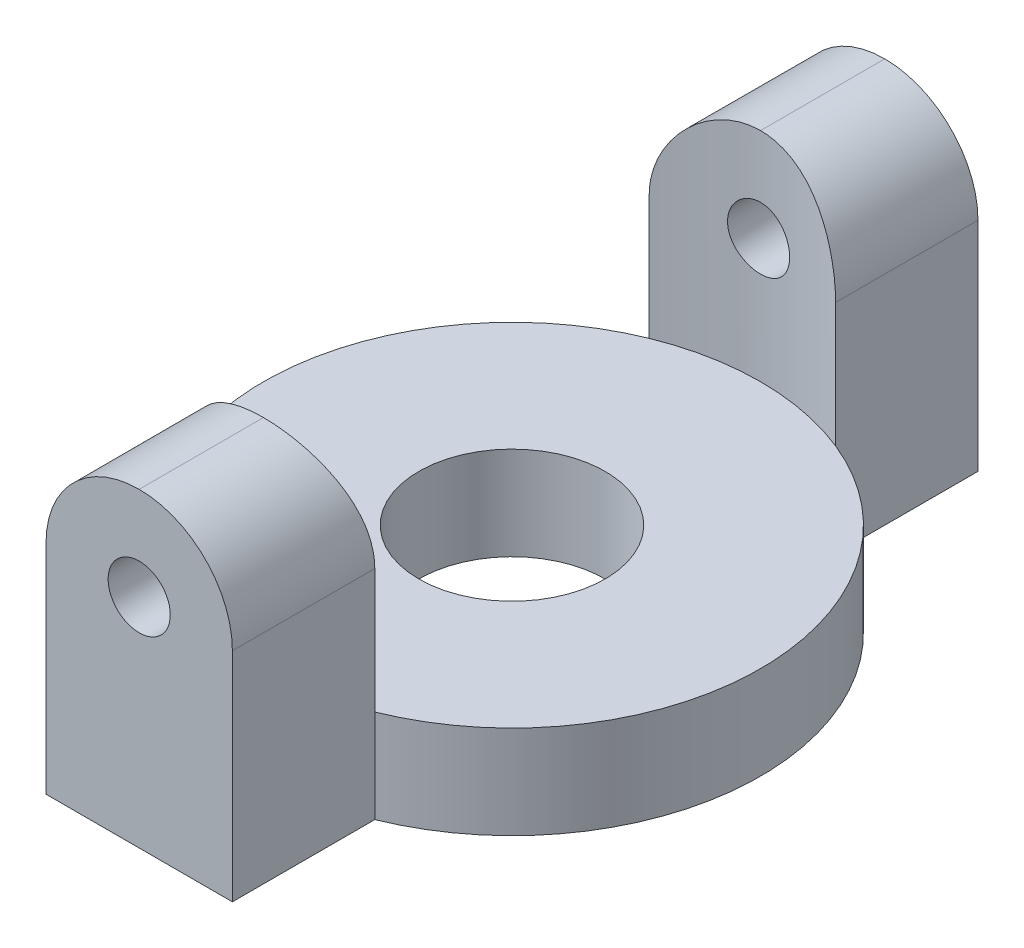
ISO-10303-21;
HEADER;
FILE_DESCRIPTION(('STEP AP214'),'2;1');
FILE_NAME('part.step','',(''),(''),'','','');
FILE_SCHEMA(('AUTOMOTIVE_DESIGN { 1 0 10303 214 1 1 1 1 }'));
ENDSEC;
DATA;
#1=APPLICATION_CONTEXT('core data for automotive mechanical design processes');
#2=APPLICATION_PROTOCOL_DEFINITION('international standard','automotive_design',2000,#1);
#3=PRODUCT_CONTEXT('',#1,'mechanical');
#4=PRODUCT('Part','Part','',(#3));
#5=PRODUCT_RELATED_PRODUCT_CATEGORY('part','',(#4));
#6=PRODUCT_DEFINITION_FORMATION('','',#4);
#7=PRODUCT_DEFINITION_CONTEXT('part definition',#1,'design');
#8=PRODUCT_DEFINITION('design','',#6,#7);
#9=PRODUCT_DEFINITION_SHAPE('','',#8);
#10=(LENGTH_UNIT() NAMED_UNIT(*) SI_UNIT(.MILLI.,.METRE.));
#11=(NAMED_UNIT(*) PLANE_ANGLE_UNIT() SI_UNIT($,.RADIAN.));
#12=(NAMED_UNIT(*) SI_UNIT($,.STERADIAN.) SOLID_ANGLE_UNIT());
#13=UNCERTAINTY_MEASURE_WITH_UNIT(LENGTH_MEASURE(1.E-05),#10,'distance_accuracy_value','');
#14=(GEOMETRIC_REPRESENTATION_CONTEXT(3) GLOBAL_UNCERTAINTY_ASSIGNED_CONTEXT((#13)) GLOBAL_UNIT_ASSIGNED_CONTEXT((#10,
#11,#12)) REPRESENTATION_CONTEXT('',''));
#15=CARTESIAN_POINT('',(0.,0.,0.));
#16=DIRECTION('',(0.,0.,1.));
#17=DIRECTION('',(1.,0.,0.));
#18=AXIS2_PLACEMENT_3D('',#15,#16,#17);
#19=CARTESIAN_POINT('',(0.,1.5,0.));
#20=DIRECTION('',(0.,-1.,0.));
#21=DIRECTION('',(0.,0.,-1.));
#22=AXIS2_PLACEMENT_3D('',#19,#20,#21);
#23=CYLINDRICAL_SURFACE('',#22,4.);
#24=DIRECTION('',(0.,-1.,0.));
#25=VECTOR('',#24,1.);
#26=CARTESIAN_POINT('',(-1.5,5.,-3.70809924354783));
#27=LINE('',#26,#25);
#28=CARTESIAN_POINT('',(-1.5,1.5,-3.70809924354783));
#29=VERTEX_POINT('',#28);
#30=CARTESIAN_POINT('',(-1.5,0.,-3.70809924354783));
#31=VERTEX_POINT('',#30);
#32=EDGE_CURVE('E139',#29,#31,#27,.T.);
#33=ORIENTED_EDGE('',*,*,#32,.T.);
#34=CARTESIAN_POINT('',(0.,0.,0.));
#35=DIRECTION('',(0.,1.,0.));
#36=DIRECTION('',(0.,0.,1.));
#37=AXIS2_PLACEMENT_3D('',#34,#35,#36);
#38=CIRCLE('',#37,4.);
#39=CARTESIAN_POINT('',(-1.5,0.,3.70809924354783));
#40=VERTEX_POINT('',#39);
#41=EDGE_CURVE('E121',#31,#40,#38,.T.);
#42=ORIENTED_EDGE('',*,*,#41,.T.);
#43=DIRECTION('',(0.,-1.,0.));
#44=VECTOR('',#43,1.);
#45=CARTESIAN_POINT('',(-1.5,1.5,3.70809924354783));
#46=LINE('',#45,#44);
#47=CARTESIAN_POINT('',(-1.5,1.5,3.70809924354783));
#48=VERTEX_POINT('',#47);
#49=EDGE_CURVE('E196',#48,#40,#46,.T.);
#50=ORIENTED_EDGE('',*,*,#49,.F.);
#51=CARTESIAN_POINT('',(0.,1.5,0.));
#52=DIRECTION('',(0.,1.,0.));
#53=DIRECTION('',(0.,0.,1.));
#54=AXIS2_PLACEMENT_3D('',#51,#52,#53);
#55=CIRCLE('',#54,4.);
#56=EDGE_CURVE('E141',#29,#48,#55,.T.);
#57=ORIENTED_EDGE('',*,*,#56,.F.);
#58=EDGE_LOOP('',(#33,#42,#50,#57));
#59=FACE_BOUND('',#58,.T.);
#60=ADVANCED_FACE('F33',(#59),#23,.T.);
#61=DIRECTION('',(0.,-1.,0.));
#62=VECTOR('',#61,1.);
#63=CARTESIAN_POINT('',(1.5,5.,-3.70809924354783));
#64=LINE('',#63,#62);
#65=CARTESIAN_POINT('',(1.5,1.5,-3.70809924354783));
#66=VERTEX_POINT('',#65);
#67=CARTESIAN_POINT('',(1.5,0.,-3.70809924354783));
#68=VERTEX_POINT('',#67);
#69=EDGE_CURVE('E170',#66,#68,#64,.T.);
#70=ORIENTED_EDGE('',*,*,#69,.F.);
#71=CARTESIAN_POINT('',(1.5,1.5,3.70809924354783));
#72=VERTEX_POINT('',#71);
#73=EDGE_CURVE('E194',#72,#66,#55,.T.);
#74=ORIENTED_EDGE('',*,*,#73,.F.);
#75=DIRECTION('',(0.,-1.,0.));
#76=VECTOR('',#75,1.);
#77=CARTESIAN_POINT('',(1.5,1.5,3.70809924354783));
#78=LINE('',#77,#76);
#79=CARTESIAN_POINT('',(1.5,0.,3.70809924354783));
#80=VERTEX_POINT('',#79);
#81=EDGE_CURVE('E200',#80,#72,#78,.F.);
#82=ORIENTED_EDGE('',*,*,#81,.F.);
#83=EDGE_CURVE('E134',#80,#68,#38,.T.);
#84=ORIENTED_EDGE('',*,*,#83,.T.);
#85=EDGE_LOOP('',(#70,#74,#82,#84));
#86=FACE_BOUND('',#85,.T.);
#87=ADVANCED_FACE('F238',(#86),#23,.T.);
#88=CARTESIAN_POINT('',(0.,1.5,0.));
#89=DIRECTION('',(0.,1.,0.));
#90=DIRECTION('',(0.,0.,1.));
#91=AXIS2_PLACEMENT_3D('',#88,#89,#90);
#92=PLANE('',#91);
#93=ORIENTED_EDGE('',*,*,#73,.T.);
#94=CARTESIAN_POINT('',(0.,1.5,0.));
#95=DIRECTION('',(0.,1.,0.));
#96=DIRECTION('',(0.,0.,1.));
#97=AXIS2_PLACEMENT_3D('',#94,#95,#96);
#98=CIRCLE('',#97,4.);
#99=EDGE_CURVE('E172',#66,#29,#98,.T.);
#100=ORIENTED_EDGE('',*,*,#99,.T.);
#101=ORIENTED_EDGE('',*,*,#56,.T.);
#102=EDGE_CURVE('E197',#48,#72,#55,.T.);
#103=ORIENTED_EDGE('',*,*,#102,.T.);
#104=EDGE_LOOP('',(#93,#100,#101,#103));
#105=FACE_BOUND('',#104,.T.);
#106=CARTESIAN_POINT('',(0.,1.5,0.));
#107=DIRECTION('',(0.,1.,0.));
#108=DIRECTION('',(0.,0.,1.));
#109=AXIS2_PLACEMENT_3D('',#106,#107,#108);
#110=CIRCLE('',#109,1.5);
#111=CARTESIAN_POINT('',(0.,1.5,1.5));
#112=VERTEX_POINT('',#111);
#113=EDGE_CURVE('E135',#112,#112,#110,.T.);
#114=ORIENTED_EDGE('',*,*,#113,.F.);
#115=EDGE_LOOP('',(#114));
#116=FACE_BOUND('',#115,.T.);
#117=ADVANCED_FACE('F235',(#105,#116),#92,.T.);
#118=CARTESIAN_POINT('',(0.,0.,0.));
#119=DIRECTION('',(0.,1.,0.));
#120=DIRECTION('',(0.,0.,1.));
#121=AXIS2_PLACEMENT_3D('',#118,#119,#120);
#122=PLANE('',#121);
#123=ORIENTED_EDGE('',*,*,#83,.F.);
#124=DIRECTION('',(0.,0.,-1.));
#125=VECTOR('',#124,1.);
#126=CARTESIAN_POINT('',(1.5,0.,3.70809924354783));
#127=LINE('',#126,#125);
#128=CARTESIAN_POINT('',(1.5,0.,5.99999999999999));
#129=VERTEX_POINT('',#128);
#130=EDGE_CURVE('E174',#129,#80,#127,.T.);
#131=ORIENTED_EDGE('',*,*,#130,.F.);
#132=DIRECTION('',(1.,0.,0.));
#133=VECTOR('',#132,1.);
#134=CARTESIAN_POINT('',(-1.5,0.,5.99999999999999));
#135=LINE('',#134,#133);
#136=CARTESIAN_POINT('',(-1.5,0.,5.99999999999999));
#137=VERTEX_POINT('',#136);
#138=EDGE_CURVE('E178',#137,#129,#135,.T.);
#139=ORIENTED_EDGE('',*,*,#138,.F.);
#140=DIRECTION('',(0.,0.,1.));
#141=VECTOR('',#140,1.);
#142=CARTESIAN_POINT('',(-1.5,0.,3.70809924354783));
#143=LINE('',#142,#141);
#144=EDGE_CURVE('E130',#40,#137,#143,.T.);
#145=ORIENTED_EDGE('',*,*,#144,.F.);
#146=ORIENTED_EDGE('',*,*,#41,.F.);
#147=DIRECTION('',(0.,0.,1.));
#148=VECTOR('',#147,1.);
#149=CARTESIAN_POINT('',(-1.5,0.,-6.));
#150=LINE('',#149,#148);
#151=CARTESIAN_POINT('',(-1.5,0.,-6.));
#152=VERTEX_POINT('',#151);
#153=EDGE_CURVE('E127',#152,#31,#150,.T.);
#154=ORIENTED_EDGE('',*,*,#153,.F.);
#155=DIRECTION('',(-1.,0.,0.));
#156=VECTOR('',#155,1.);
#157=CARTESIAN_POINT('',(-1.5,0.,-6.));
#158=LINE('',#157,#156);
#159=CARTESIAN_POINT('',(1.5,0.,-6.));
#160=VERTEX_POINT('',#159);
#161=EDGE_CURVE('E155',#160,#152,#158,.T.);
#162=ORIENTED_EDGE('',*,*,#161,.F.);
#163=DIRECTION('',(0.,0.,-1.));
#164=VECTOR('',#163,1.);
#165=CARTESIAN_POINT('',(1.5,0.,-6.));
#166=LINE('',#165,#164);
#167=EDGE_CURVE('E151',#68,#160,#166,.T.);
#168=ORIENTED_EDGE('',*,*,#167,.F.);
#169=EDGE_LOOP('',(#123,#131,#139,#145,#146,#154,#162,#168));
#170=FACE_BOUND('',#169,.T.);
#171=CARTESIAN_POINT('',(0.,0.,0.));
#172=DIRECTION('',(0.,1.,0.));
#173=DIRECTION('',(0.,0.,1.));
#174=AXIS2_PLACEMENT_3D('',#171,#172,#173);
#175=CIRCLE('',#174,1.5);
#176=CARTESIAN_POINT('',(0.,0.,1.5));
#177=VERTEX_POINT('',#176);
#178=EDGE_CURVE('E189',#177,#177,#175,.T.);
#179=ORIENTED_EDGE('',*,*,#178,.T.);
#180=EDGE_LOOP('',(#179));
#181=FACE_BOUND('',#180,.T.);
#182=ADVANCED_FACE('F123',(#170,#181),#122,.F.);
#183=CARTESIAN_POINT('',(0.,1.5,0.));
#184=DIRECTION('',(0.,-1.,0.));
#185=DIRECTION('',(0.,0.,-1.));
#186=AXIS2_PLACEMENT_3D('',#183,#184,#185);
#187=CYLINDRICAL_SURFACE('',#186,1.5);
#188=ORIENTED_EDGE('',*,*,#113,.T.);
#189=EDGE_LOOP('',(#188));
#190=FACE_BOUND('',#189,.T.);
#191=ORIENTED_EDGE('',*,*,#178,.F.);
#192=EDGE_LOOP('',(#191));
#193=FACE_BOUND('',#192,.T.);
#194=ADVANCED_FACE('F230',(#190,#193),#187,.F.);
#195=CARTESIAN_POINT('',(1.5,5.,3.70809924354783));
#196=DIRECTION('',(-1.,0.,0.));
#197=DIRECTION('',(0.,0.,1.));
#198=AXIS2_PLACEMENT_3D('',#195,#196,#197);
#199=PLANE('',#198);
#200=DIRECTION('',(0.,-1.,0.));
#201=VECTOR('',#200,1.);
#202=CARTESIAN_POINT('',(1.5,5.,3.70809924354783));
#203=LINE('',#202,#201);
#204=CARTESIAN_POINT('',(1.5,3.5,3.70809924354783));
#205=VERTEX_POINT('',#204);
#206=EDGE_CURVE('E187',#205,#72,#203,.T.);
#207=ORIENTED_EDGE('',*,*,#206,.F.);
#208=DIRECTION('',(0.,0.,-1.));
#209=VECTOR('',#208,1.);
#210=CARTESIAN_POINT('',(1.5,3.5,5.99999999999999));
#211=LINE('',#210,#209);
#212=CARTESIAN_POINT('',(1.5,3.5,5.99999999999999));
#213=VERTEX_POINT('',#212);
#214=EDGE_CURVE('E260',#205,#213,#211,.F.);
#215=ORIENTED_EDGE('',*,*,#214,.T.);
#216=DIRECTION('',(0.,-1.,0.));
#217=VECTOR('',#216,1.);
#218=CARTESIAN_POINT('',(1.5,5.,5.99999999999999));
#219=LINE('',#218,#217);
#220=EDGE_CURVE('E181',#213,#129,#219,.T.);
#221=ORIENTED_EDGE('',*,*,#220,.T.);
#222=ORIENTED_EDGE('',*,*,#130,.T.);
#223=ORIENTED_EDGE('',*,*,#81,.T.);
#224=EDGE_LOOP('',(#207,#215,#221,#222,#223));
#225=FACE_BOUND('',#224,.T.);
#226=ADVANCED_FACE('F223',(#225),#199,.F.);
#227=CARTESIAN_POINT('',(0.,5.,0.));
#228=DIRECTION('',(0.,-1.,0.));
#229=DIRECTION('',(0.,0.,-1.));
#230=AXIS2_PLACEMENT_3D('',#227,#228,#229);
#231=CYLINDRICAL_SURFACE('',#230,4.);
#232=CARTESIAN_POINT('',(0.5,3.5,3.96862696659689));
#233=CARTESIAN_POINT('',(0.49999881096679,3.52796725675837,3.96862736834266));
#234=CARTESIAN_POINT('',(0.497645579804257,3.55595199298096,3.96892579023789));
#235=CARTESIAN_POINT('',(0.488295282744268,3.61114264508092,3.97008678195994));
#236=CARTESIAN_POINT('',(0.481293364218259,3.63834771609941,3.97094994128592));
#237=CARTESIAN_POINT('',(0.462855338565192,3.69117197642321,3.97314114755086));
#238=CARTESIAN_POINT('',(0.451422240959648,3.71679222842373,3.9744688789073));
#239=CARTESIAN_POINT('',(0.424452839685906,3.76574569036462,3.97743924703982));
#240=CARTESIAN_POINT('',(0.408917237474958,3.78907929034861,3.97908182996857));
#241=CARTESIAN_POINT('',(0.374090690052884,3.83293244942443,3.9825071184878));
#242=CARTESIAN_POINT('',(0.354781363004859,3.85343736046378,3.98429048340409));
#243=CARTESIAN_POINT('',(0.312995052134246,3.89092455378782,3.98779046575167));
#244=CARTESIAN_POINT('',(0.290517910811607,3.90790666081894,3.98950707985877));
#245=CARTESIAN_POINT('',(0.242941966135194,3.93791871590127,3.99268688922565));
#246=CARTESIAN_POINT('',(0.217834739112223,3.95093540901993,3.99414922769361));
#247=CARTESIAN_POINT('',(0.165769343611183,3.97256223998819,3.99664847390905));
#248=CARTESIAN_POINT('',(0.138811243872181,3.9811725413853,3.99768539744594));
#249=CARTESIAN_POINT('',(0.0839591375502225,3.99369841366689,3.99921233741246));
#250=CARTESIAN_POINT('',(0.0560707719326756,3.99763833570478,3.99970518967188));
#251=CARTESIAN_POINT('',(2.46401373093254E-05,4.00078707700731,4.00009813945843));
#252=CARTESIAN_POINT('',(-0.0281331153989542,3.99999608239051,3.99999826030416));
#253=CARTESIAN_POINT('',(-0.0837530537949095,3.99372495944852,3.99921929554002));
#254=CARTESIAN_POINT('',(-0.111218241152891,3.98827102030373,3.99854344491145));
#255=CARTESIAN_POINT('',(-0.164840432781075,3.97286976467401,3.99669211188467));
#256=CARTESIAN_POINT('',(-0.190997412171241,3.96292236276663,3.99551661998809));
#257=CARTESIAN_POINT('',(-0.241341763087728,3.93878870144324,3.99279251561583));
#258=CARTESIAN_POINT('',(-0.265523645568104,3.92459110845396,3.99124290768648));
#259=CARTESIAN_POINT('',(-0.311171490461295,3.89236832755679,3.98794393813057));
#260=CARTESIAN_POINT('',(-0.332637328243472,3.87434296410629,3.98619456734453));
#261=CARTESIAN_POINT('',(-0.372397606154589,3.83482963628032,3.98267773504703));
#262=CARTESIAN_POINT('',(-0.390669367999199,3.81331884809067,3.98091023160946));
#263=CARTESIAN_POINT('',(-0.423346570125021,3.76752368864351,3.97756814388116));
#264=CARTESIAN_POINT('',(-0.437751998287019,3.74323930869239,3.97599356019516));
#265=CARTESIAN_POINT('',(-0.462288914716547,3.69256610088754,3.97321560522544));
#266=CARTESIAN_POINT('',(-0.472418585972466,3.66617638400936,3.97201239181626));
#267=CARTESIAN_POINT('',(-0.488096330893618,3.61205210929463,3.97011648499191));
#268=CARTESIAN_POINT('',(-0.493644625359924,3.58431761633826,3.96942376697341));
#269=CARTESIAN_POINT('',(-0.499972086381722,3.52849136360005,3.9686317775681));
#270=CARTESIAN_POINT('',(-0.500783168399657,3.50040327538224,3.96852853488475));
#271=CARTESIAN_POINT('',(-0.497697390646112,3.44449161406692,3.9689166822393));
#272=CARTESIAN_POINT('',(-0.493800631221962,3.41666803534414,3.9694080596029));
#273=CARTESIAN_POINT('',(-0.481436657159546,3.36217084728443,3.97092645696797));
#274=CARTESIAN_POINT('',(-0.472984896749212,3.33549367696192,3.97195166538932));
#275=CARTESIAN_POINT('',(-0.451766743823226,3.28393516902937,3.97442073994161));
#276=CARTESIAN_POINT('',(-0.439000199716245,3.25905389455183,3.97586462078153));
#277=CARTESIAN_POINT('',(-0.409436404430984,3.2116490712374,3.97901786270647));
#278=CARTESIAN_POINT('',(-0.392618223915422,3.18913866693712,3.98072858547417));
#279=CARTESIAN_POINT('',(-0.355458148473791,3.14724868921299,3.98421847910205));
#280=CARTESIAN_POINT('',(-0.335116116485097,3.1278692376264,3.98599765262258));
#281=CARTESIAN_POINT('',(-0.291346355111705,3.09267916253312,3.98943617737392));
#282=CARTESIAN_POINT('',(-0.267901698423407,3.076889510641,3.99109478782504));
#283=CARTESIAN_POINT('',(-0.218674516336358,3.04947235647324,3.99409422606322));
#284=CARTESIAN_POINT('',(-0.192892038073665,3.0378447703038,3.99543506025543));
#285=CARTESIAN_POINT('',(-0.139790771827891,3.01911644261839,3.99764458130638));
#286=CARTESIAN_POINT('',(-0.112476313302356,3.01200358079368,3.99851453137541));
#287=CARTESIAN_POINT('',(-0.0570292114555923,3.00246718215465,3.99968950935513));
#288=CARTESIAN_POINT('',(-0.0288966050876216,3.00004343388015,3.99999456274035));
#289=CARTESIAN_POINT('',(0.0271834366687568,2.99995801554157,4.00000525602733));
#290=CARTESIAN_POINT('',(0.0551308275429468,3.00226400788641,3.99971496633568));
#291=CARTESIAN_POINT('',(0.110237548290523,3.01150412268617,3.99857568231588));
#292=CARTESIAN_POINT('',(0.13739687871197,3.01843824192235,3.99772668837629));
#293=CARTESIAN_POINT('',(0.190152288597463,3.03672762286994,3.99556497042407));
#294=CARTESIAN_POINT('',(0.215748912031914,3.04808133587464,3.99425240886894));
#295=CARTESIAN_POINT('',(0.264678667428805,3.07488426292151,3.99130889521256));
#296=CARTESIAN_POINT('',(0.288011772477606,3.09033352565234,3.98967793932624));
#297=CARTESIAN_POINT('',(0.331917353592512,3.12500864306728,3.98626638785116));
#298=CARTESIAN_POINT('',(0.35247075756686,3.14425855870473,3.98448488255784));
#299=CARTESIAN_POINT('',(0.390068223763869,3.18593858880577,3.98098031802708));
#300=CARTESIAN_POINT('',(0.407111453558698,3.20836945549818,3.97925727273399));
#301=CARTESIAN_POINT('',(0.437261048503207,3.25587398453947,3.97605762278938));
#302=CARTESIAN_POINT('',(0.450351956633347,3.28095751798702,3.97458199550457));
#303=CARTESIAN_POINT('',(0.472117057668671,3.33297134811895,3.97205571623925));
#304=CARTESIAN_POINT('',(0.480796054245663,3.35989959986068,3.97100460230776));
#305=CARTESIAN_POINT('',(0.491413179247596,3.40580599740871,3.96970157363969));
#306=CARTESIAN_POINT('',(0.494628606202116,3.42449459030751,3.96930060304382));
#307=CARTESIAN_POINT('',(0.498922411181102,3.46211944999339,3.96876316445983));
#308=CARTESIAN_POINT('',(0.500000805419864,3.48105571490019,3.96862669446485));
#309=CARTESIAN_POINT('',(0.5,3.5,3.96862696659689));
#310=B_SPLINE_CURVE_WITH_KNOTS('',3,(#232,#233,#234,#235,#236,#237,#238,#239,#240,#241,#242,
#243,#244,#245,#246,#247,#248,#249,#250,#251,#252,#253,#254,#255,#256,#257,#258,#259,#260,#261,
#262,#263,#264,#265,#266,#267,#268,#269,#270,#271,#272,#273,#274,#275,#276,#277,#278,#279,#280,
#281,#282,#283,#284,#285,#286,#287,#288,#289,#290,#291,#292,#293,#294,#295,#296,#297,#298,#299,
#300,#301,#302,#303,#304,#305,#306,#307,#308,#309),.UNSPECIFIED.,.T.,.F.,(4,2,2,2,2,2,2,2,2,2,2,
2,2,2,2,2,2,2,2,2,2,2,2,2,2,2,2,2,2,2,2,2,2,2,2,2,2,2,4),(0.,0.0838325634958481,
0.167752775230476,0.251616090516241,0.335465075901226,0.419733155098132,0.504005425485158,
0.588556372291482,0.673104180679661,0.757209193882915,0.841310898340217,0.924943329866078,
1.00857735134358,1.09243640882561,1.17629931293821,1.26073539475554,1.34517174123885,
1.42964393347802,1.51411205431238,1.59801043561177,1.68190702865423,1.76552075258547,
1.84913741442371,1.93319563908822,2.01725713398962,2.10179777178469,2.18633670541776,
2.27064771356988,2.35495491954562,2.43868763257651,2.52242028737358,2.60612362708818,
2.6898279619285,2.77408025778167,2.85835251087966,2.94295019540967,3.02745557196403,
3.0842419792659,3.14102795571095),.UNSPECIFIED.);
#311=CARTESIAN_POINT('',(0.5,3.5,3.96862696659689));
#312=VERTEX_POINT('',#311);
#313=EDGE_CURVE('E152',#312,#312,#310,.T.);
#314=ORIENTED_EDGE('',*,*,#313,.T.);
#315=EDGE_LOOP('',(#314));
#316=FACE_BOUND('',#315,.T.);
#317=CARTESIAN_POINT('',(-1.5,3.5,3.70809924354783));
#318=CARTESIAN_POINT('',(-1.50000149763685,3.54059406944469,3.70809443488223));
#319=CARTESIAN_POINT('',(-1.49835105709716,3.58116700210062,3.70876668409977));
#320=CARTESIAN_POINT('',(-1.49177843163965,3.66199064316089,3.71141698257091));
#321=CARTESIAN_POINT('',(-1.48685734569824,3.70224145520554,3.71339459320577));
#322=CARTESIAN_POINT('',(-1.4672933482067,3.82177317368298,3.72119033682707));
#323=CARTESIAN_POINT('',(-1.44784901310297,3.90020255023084,3.72887225208868));
#324=CARTESIAN_POINT('',(-1.39690282812453,4.05236605283321,3.74825199333564));
#325=CARTESIAN_POINT('',(-1.3654109118427,4.12610398885652,3.75994650999366));
#326=CARTESIAN_POINT('',(-1.29134257885079,4.26733093712752,3.7860233337759));
#327=CARTESIAN_POINT('',(-1.24875666733342,4.33481452918674,3.80040794022651));
#328=CARTESIAN_POINT('',(-1.15146673631305,4.46489112753932,3.83103570457935));
#329=CARTESIAN_POINT('',(-1.0963044481655,4.52712847355882,3.84733331324471));
#330=CARTESIAN_POINT('',(-0.976395613097514,4.64172247941678,3.87949750401637));
#331=CARTESIAN_POINT('',(-0.911646994469713,4.69407699789396,3.89536399207354));
#332=CARTESIAN_POINT('',(-0.771671110191594,4.78915642250939,3.92553400925355));
#333=CARTESIAN_POINT('',(-0.696160035999175,4.83148819478568,3.93976501267995));
#334=CARTESIAN_POINT('',(-0.538489868027629,4.90267340318421,3.9643883038365));
#335=CARTESIAN_POINT('',(-0.456337903183922,4.93154107325354,3.97478464304361));
#336=CARTESIAN_POINT('',(-0.311568360413164,4.96861663077048,3.98831063781509));
#337=CARTESIAN_POINT('',(-0.249946259701632,4.98035013677682,3.9926612104967));
#338=CARTESIAN_POINT('',(-0.125564806183786,4.99605565812349,3.99852089820637));
#339=CARTESIAN_POINT('',(-0.0628049882167099,5.00002442312907,4.00002882328735));
#340=CARTESIAN_POINT('',(0.,5.,4.));
#341=B_SPLINE_CURVE_WITH_KNOTS('',3,(#317,#318,#319,#320,#321,#322,#323,#324,#325,#326,#327,
#328,#329,#330,#331,#332,#333,#334,#335,#336,#337,#338,#339,#340),.UNSPECIFIED.,.F.,.F.,(4,2,2,
2,2,2,2,2,2,2,2,4),(0.,0.121702070650528,0.243363268593939,0.485593089370354,0.727623613350252,
0.969861963846905,1.2229773776272,1.47614757238601,1.73802530937247,1.9996255640306,
2.18773738057225,2.37592792422954),.UNSPECIFIED.);
#342=CARTESIAN_POINT('',(-1.5,3.5,3.70809924354783));
#343=VERTEX_POINT('',#342);
#344=CARTESIAN_POINT('',(0.,5.,4.));
#345=VERTEX_POINT('',#344);
#346=EDGE_CURVE('E203',#343,#345,#341,.T.);
#347=ORIENTED_EDGE('',*,*,#346,.T.);
#348=CARTESIAN_POINT('',(0.,5.,4.));
#349=CARTESIAN_POINT('',(0.0406958829842198,5.00000122845831,4.0000033265242));
#350=CARTESIAN_POINT('',(0.0813709954107109,4.99834275632345,3.99937821643425));
#351=CARTESIAN_POINT('',(0.162404982142701,4.99173638518745,3.99690675065887));
#352=CARTESIAN_POINT('',(0.202763939083231,4.98678937686733,3.99506072565186));
#353=CARTESIAN_POINT('',(0.32265881815323,4.96711313108877,3.98776419542613));
#354=CARTESIAN_POINT('',(0.401351138250184,4.9475480884414,3.98055464040178));
#355=CARTESIAN_POINT('',(0.554057247937609,4.8962512721869,3.96219014943225));
#356=CARTESIAN_POINT('',(0.628073544622791,4.86452608396418,3.9510373492233));
#357=CARTESIAN_POINT('',(0.769768846215146,4.78991107942991,3.92589331480545));
#358=CARTESIAN_POINT('',(0.837443568408162,4.74701379100632,3.91190018231573));
#359=CARTESIAN_POINT('',(0.967344906860733,4.64938932798856,3.88186303805133));
#360=CARTESIAN_POINT('',(1.02926635746347,4.59427422550101,3.86576126025821));
#361=CARTESIAN_POINT('',(1.14324026520414,4.47459381666284,3.83360332452307));
#362=CARTESIAN_POINT('',(1.19528897996651,4.41002494311775,3.8175471861438));
#363=CARTESIAN_POINT('',(1.2900021675008,4.27025419725675,3.78661824913521));
#364=CARTESIAN_POINT('',(1.3322282773455,4.19473869535199,3.77181479391607));
#365=CARTESIAN_POINT('',(1.40321260233322,4.03707429030074,3.74598828763862));
#366=CARTESIAN_POINT('',(1.43198755826084,3.95493378254983,3.73496054207913));
#367=CARTESIAN_POINT('',(1.4688507799066,3.81040612672523,3.72058587751727));
#368=CARTESIAN_POINT('',(1.4804930770667,3.749033432505,3.71594709538589));
#369=CARTESIAN_POINT('',(1.49608314541372,3.62512431775426,3.7096837811096));
#370=CARTESIAN_POINT('',(1.50002515651037,3.56258706136285,3.70806150546337));
#371=CARTESIAN_POINT('',(1.5,3.5,3.70809924354783));
#372=B_SPLINE_CURVE_WITH_KNOTS('',3,(#348,#349,#350,#351,#352,#353,#354,#355,#356,#357,#358,
#359,#360,#361,#362,#363,#364,#365,#366,#367,#368,#369,#370,#371),.UNSPECIFIED.,.F.,.F.,(4,2,2,
2,2,2,2,2,2,2,2,4),(0.,0.122008525653372,0.24398401945963,0.486933412549049,0.729751420715098,
0.97273224908806,1.2249558748475,1.47727491867926,1.73930674597636,2.0010115846268,
2.18839922255604,2.37592697956526),.UNSPECIFIED.);
#373=EDGE_CURVE('E209',#345,#205,#372,.T.);
#374=ORIENTED_EDGE('',*,*,#373,.T.);
#375=ORIENTED_EDGE('',*,*,#206,.T.);
#376=ORIENTED_EDGE('',*,*,#102,.F.);
#377=DIRECTION('',(0.,-1.,0.));
#378=VECTOR('',#377,1.);
#379=CARTESIAN_POINT('',(-1.5,5.,3.70809924354783));
#380=LINE('',#379,#378);
#381=EDGE_CURVE('E185',#343,#48,#380,.T.);
#382=ORIENTED_EDGE('',*,*,#381,.F.);
#383=EDGE_LOOP('',(#347,#374,#375,#376,#382));
#384=FACE_BOUND('',#383,.T.);
#385=ADVANCED_FACE('F217',(#316,#384),#231,.F.);
#386=CARTESIAN_POINT('',(-1.5,5.,3.70809924354783));
#387=DIRECTION('',(1.,0.,0.));
#388=DIRECTION('',(0.,0.,-1.));
#389=AXIS2_PLACEMENT_3D('',#386,#387,#388);
#390=PLANE('',#389);
#391=DIRECTION('',(0.,-1.,0.));
#392=VECTOR('',#391,1.);
#393=CARTESIAN_POINT('',(-1.5,5.,5.99999999999999));
#394=LINE('',#393,#392);
#395=CARTESIAN_POINT('',(-1.5,3.5,5.99999999999999));
#396=VERTEX_POINT('',#395);
#397=EDGE_CURVE('E183',#396,#137,#394,.T.);
#398=ORIENTED_EDGE('',*,*,#397,.F.);
#399=DIRECTION('',(0.,0.,1.));
#400=VECTOR('',#399,1.);
#401=CARTESIAN_POINT('',(-1.5,3.5,3.70809924354783));
#402=LINE('',#401,#400);
#403=EDGE_CURVE('E266',#396,#343,#402,.F.);
#404=ORIENTED_EDGE('',*,*,#403,.T.);
#405=ORIENTED_EDGE('',*,*,#381,.T.);
#406=ORIENTED_EDGE('',*,*,#49,.T.);
#407=ORIENTED_EDGE('',*,*,#144,.T.);
#408=EDGE_LOOP('',(#398,#404,#405,#406,#407));
#409=FACE_BOUND('',#408,.T.);
#410=ADVANCED_FACE('F222',(#409),#390,.F.);
#411=CARTESIAN_POINT('',(-1.5,5.,5.99999999999999));
#412=DIRECTION('',(0.,0.,-1.));
#413=DIRECTION('',(-1.,0.,0.));
#414=AXIS2_PLACEMENT_3D('',#411,#412,#413);
#415=PLANE('',#414);
#416=CARTESIAN_POINT('',(0.,3.5,5.99999999999999));
#417=DIRECTION('',(0.,0.,1.));
#418=DIRECTION('',(1.,0.,0.));
#419=AXIS2_PLACEMENT_3D('',#416,#417,#418);
#420=CIRCLE('',#419,0.5);
#421=CARTESIAN_POINT('',(0.5,3.5,5.99999999999999));
#422=VERTEX_POINT('',#421);
#423=EDGE_CURVE('E321',#422,#422,#420,.T.);
#424=ORIENTED_EDGE('',*,*,#423,.F.);
#425=EDGE_LOOP('',(#424));
#426=FACE_BOUND('',#425,.T.);
#427=ORIENTED_EDGE('',*,*,#220,.F.);
#428=CARTESIAN_POINT('',(0.,3.5,5.99999999999999));
#429=DIRECTION('',(0.,0.,-1.));
#430=DIRECTION('',(-1.,0.,0.));
#431=AXIS2_PLACEMENT_3D('',#428,#429,#430);
#432=CIRCLE('',#431,1.5);
#433=CARTESIAN_POINT('',(0.,5.,5.99999999999999));
#434=VERTEX_POINT('',#433);
#435=EDGE_CURVE('E257',#213,#434,#432,.F.);
#436=ORIENTED_EDGE('',*,*,#435,.T.);
#437=CARTESIAN_POINT('',(0.,3.5,5.99999999999999));
#438=DIRECTION('',(0.,0.,-1.));
#439=DIRECTION('',(-1.,0.,0.));
#440=AXIS2_PLACEMENT_3D('',#437,#438,#439);
#441=CIRCLE('',#440,1.5);
#442=EDGE_CURVE('E267',#434,#396,#441,.F.);
#443=ORIENTED_EDGE('',*,*,#442,.T.);
#444=ORIENTED_EDGE('',*,*,#397,.T.);
#445=ORIENTED_EDGE('',*,*,#138,.T.);
#446=EDGE_LOOP('',(#427,#436,#443,#444,#445));
#447=FACE_BOUND('',#446,.T.);
#448=ADVANCED_FACE('F270',(#426,#447),#415,.F.);
#449=CARTESIAN_POINT('',(-1.5,5.,-6.));
#450=DIRECTION('',(1.,0.,0.));
#451=DIRECTION('',(0.,0.,-1.));
#452=AXIS2_PLACEMENT_3D('',#449,#450,#451);
#453=PLANE('',#452);
#454=CARTESIAN_POINT('',(-1.5,3.5,-3.70809924354783));
#455=VERTEX_POINT('',#454);
#456=EDGE_CURVE('E144',#455,#29,#27,.T.);
#457=ORIENTED_EDGE('',*,*,#456,.F.);
#458=DIRECTION('',(0.,0.,1.));
#459=VECTOR('',#458,1.);
#460=CARTESIAN_POINT('',(-1.5,3.5,-6.));
#461=LINE('',#460,#459);
#462=CARTESIAN_POINT('',(-1.5,3.5,-6.));
#463=VERTEX_POINT('',#462);
#464=EDGE_CURVE('E11',#455,#463,#461,.F.);
#465=ORIENTED_EDGE('',*,*,#464,.T.);
#466=DIRECTION('',(0.,-1.,0.));
#467=VECTOR('',#466,1.);
#468=CARTESIAN_POINT('',(-1.5,5.,-6.));
#469=LINE('',#468,#467);
#470=EDGE_CURVE('E149',#463,#152,#469,.T.);
#471=ORIENTED_EDGE('',*,*,#470,.T.);
#472=ORIENTED_EDGE('',*,*,#153,.T.);
#473=ORIENTED_EDGE('',*,*,#32,.F.);
#474=EDGE_LOOP('',(#457,#465,#471,#472,#473));
#475=FACE_BOUND('',#474,.T.);
#476=ADVANCED_FACE('F147',(#475),#453,.F.);
#477=CARTESIAN_POINT('',(0.,5.,0.));
#478=DIRECTION('',(0.,-1.,0.));
#479=DIRECTION('',(0.,0.,-1.));
#480=AXIS2_PLACEMENT_3D('',#477,#478,#479);
#481=CYLINDRICAL_SURFACE('',#480,4.);
#482=CARTESIAN_POINT('',(0.5,3.5,-3.96862696659689));
#483=CARTESIAN_POINT('',(0.49999881096679,3.47203274324163,-3.96862736834266));
#484=CARTESIAN_POINT('',(0.497645579804257,3.44404800701904,-3.96892579023789));
#485=CARTESIAN_POINT('',(0.488295282744268,3.38885735491908,-3.97008678195994));
#486=CARTESIAN_POINT('',(0.481293364218259,3.36165228390059,-3.97094994128592));
#487=CARTESIAN_POINT('',(0.462855338565192,3.30882802357679,-3.97314114755086));
#488=CARTESIAN_POINT('',(0.451422240959648,3.28320777157627,-3.9744688789073));
#489=CARTESIAN_POINT('',(0.424452839685906,3.23425430963538,-3.97743924703982));
#490=CARTESIAN_POINT('',(0.408917237474958,3.21092070965139,-3.97908182996857));
#491=CARTESIAN_POINT('',(0.374090690052884,3.16706755057557,-3.9825071184878));
#492=CARTESIAN_POINT('',(0.354781363004859,3.14656263953622,-3.98429048340409));
#493=CARTESIAN_POINT('',(0.312995052134246,3.10907544621219,-3.98779046575167));
#494=CARTESIAN_POINT('',(0.290517910811607,3.09209333918106,-3.98950707985877));
#495=CARTESIAN_POINT('',(0.242941966135194,3.06208128409873,-3.99268688922565));
#496=CARTESIAN_POINT('',(0.217834739112223,3.04906459098007,-3.99414922769361));
#497=CARTESIAN_POINT('',(0.165769343611183,3.02743776001181,-3.99664847390906));
#498=CARTESIAN_POINT('',(0.138811243872181,3.0188274586147,-3.99768539744594));
#499=CARTESIAN_POINT('',(0.0839591375502223,3.00630158633311,-3.99921233741246));
#500=CARTESIAN_POINT('',(0.0560707719326753,3.00236166429522,-3.99970518967188));
#501=CARTESIAN_POINT('',(2.46401373091187E-05,2.99921292299269,-4.00009813945843));
#502=CARTESIAN_POINT('',(-0.0281331153989544,3.00000391760949,-3.99999826030416));
#503=CARTESIAN_POINT('',(-0.0837530537949098,3.00627504055148,-3.99921929554002));
#504=CARTESIAN_POINT('',(-0.111218241152891,3.01172897969627,-3.99854344491145));
#505=CARTESIAN_POINT('',(-0.164840432781075,3.02713023532599,-3.99669211188467));
#506=CARTESIAN_POINT('',(-0.190997412171241,3.03707763723337,-3.99551661998809));
#507=CARTESIAN_POINT('',(-0.241341763087728,3.06121129855676,-3.99279251561583));
#508=CARTESIAN_POINT('',(-0.265523645568104,3.07540889154604,-3.99124290768648));
#509=CARTESIAN_POINT('',(-0.311171490461296,3.10763167244321,-3.98794393813057));
#510=CARTESIAN_POINT('',(-0.332637328243472,3.12565703589371,-3.98619456734453));
#511=CARTESIAN_POINT('',(-0.372397606154589,3.16517036371968,-3.98267773504703));
#512=CARTESIAN_POINT('',(-0.3906693679992,3.18668115190933,-3.98091023160946));
#513=CARTESIAN_POINT('',(-0.423346570125022,3.23247631135649,-3.97756814388116));
#514=CARTESIAN_POINT('',(-0.437751998287019,3.25676069130761,-3.97599356019516));
#515=CARTESIAN_POINT('',(-0.462288914716547,3.30743389911247,-3.97321560522544));
#516=CARTESIAN_POINT('',(-0.472418585972466,3.33382361599064,-3.97201239181626));
#517=CARTESIAN_POINT('',(-0.488096330893618,3.38794789070537,-3.97011648499191));
#518=CARTESIAN_POINT('',(-0.493644625359924,3.41568238366174,-3.96942376697341));
#519=CARTESIAN_POINT('',(-0.499972086381722,3.47150863639995,-3.9686317775681));
#520=CARTESIAN_POINT('',(-0.500783168399657,3.49959672461776,-3.96852853488475));
#521=CARTESIAN_POINT('',(-0.497697390646112,3.55550838593308,-3.9689166822393));
#522=CARTESIAN_POINT('',(-0.493800631221962,3.58333196465586,-3.9694080596029));
#523=CARTESIAN_POINT('',(-0.481436657159545,3.63782915271557,-3.97092645696797));
#524=CARTESIAN_POINT('',(-0.472984896749212,3.66450632303808,-3.97195166538932));
#525=CARTESIAN_POINT('',(-0.451766743823226,3.71606483097063,-3.97442073994161));
#526=CARTESIAN_POINT('',(-0.439000199716245,3.74094610544817,-3.97586462078153));
#527=CARTESIAN_POINT('',(-0.409436404430984,3.7883509287626,-3.97901786270647));
#528=CARTESIAN_POINT('',(-0.392618223915421,3.81086133306289,-3.98072858547417));
#529=CARTESIAN_POINT('',(-0.355458148473791,3.85275131078701,-3.98421847910205));
#530=CARTESIAN_POINT('',(-0.335116116485097,3.8721307623736,-3.98599765262258));
#531=CARTESIAN_POINT('',(-0.291346355111704,3.90732083746688,-3.98943617737392));
#532=CARTESIAN_POINT('',(-0.267901698423407,3.923110489359,-3.99109478782504));
#533=CARTESIAN_POINT('',(-0.218674516336358,3.95052764352676,-3.99409422606322));
#534=CARTESIAN_POINT('',(-0.192892038073664,3.96215522969619,-3.99543506025543));
#535=CARTESIAN_POINT('',(-0.139790771827891,3.98088355738161,-3.99764458130638));
#536=CARTESIAN_POINT('',(-0.112476313302356,3.98799641920632,-3.99851453137541));
#537=CARTESIAN_POINT('',(-0.057029211455592,3.99753281784535,-3.99968950935513));
#538=CARTESIAN_POINT('',(-0.0288966050876214,3.99995656611985,-3.99999456274035));
#539=CARTESIAN_POINT('',(0.0271834366687569,4.00004198445843,-4.00000525602733));
#540=CARTESIAN_POINT('',(0.055130827542947,3.99773599211359,-3.99971496633568));
#541=CARTESIAN_POINT('',(0.110237548290523,3.98849587731383,-3.99857568231588));
#542=CARTESIAN_POINT('',(0.13739687871197,3.98156175807765,-3.99772668837629));
#543=CARTESIAN_POINT('',(0.190152288597463,3.96327237713006,-3.99556497042407));
#544=CARTESIAN_POINT('',(0.215748912031915,3.95191866412536,-3.99425240886894));
#545=CARTESIAN_POINT('',(0.264678667428805,3.92511573707849,-3.99130889521256));
#546=CARTESIAN_POINT('',(0.288011772477606,3.90966647434766,-3.98967793932624));
#547=CARTESIAN_POINT('',(0.331917353592512,3.87499135693272,-3.98626638785116));
#548=CARTESIAN_POINT('',(0.35247075756686,3.85574144129527,-3.98448488255784));
#549=CARTESIAN_POINT('',(0.390068223763869,3.81406141119423,-3.98098031802708));
#550=CARTESIAN_POINT('',(0.407111453558698,3.79163054450182,-3.979257272734));
#551=CARTESIAN_POINT('',(0.437261048503207,3.74412601546053,-3.97605762278938));
#552=CARTESIAN_POINT('',(0.450351956633347,3.71904248201298,-3.97458199550456));
#553=CARTESIAN_POINT('',(0.472117057668671,3.66702865188105,-3.97205571623925));
#554=CARTESIAN_POINT('',(0.480796054245663,3.64010040013932,-3.97100460230776));
#555=CARTESIAN_POINT('',(0.491413179247596,3.59419400259129,-3.96970157363969));
#556=CARTESIAN_POINT('',(0.494628606202116,3.57550540969249,-3.96930060304382));
#557=CARTESIAN_POINT('',(0.498922411181102,3.53788055000661,-3.96876316445983));
#558=CARTESIAN_POINT('',(0.500000805419864,3.51894428509981,-3.96862669446485));
#559=CARTESIAN_POINT('',(0.5,3.5,-3.96862696659689));
#560=B_SPLINE_CURVE_WITH_KNOTS('',3,(#482,#483,#484,#485,#486,#487,#488,#489,#490,#491,#492,
#493,#494,#495,#496,#497,#498,#499,#500,#501,#502,#503,#504,#505,#506,#507,#508,#509,#510,#511,
#512,#513,#514,#515,#516,#517,#518,#519,#520,#521,#522,#523,#524,#525,#526,#527,#528,#529,#530,
#531,#532,#533,#534,#535,#536,#537,#538,#539,#540,#541,#542,#543,#544,#545,#546,#547,#548,#549,
#550,#551,#552,#553,#554,#555,#556,#557,#558,#559),.UNSPECIFIED.,.T.,.F.,(4,2,2,2,2,2,2,2,2,2,2,
2,2,2,2,2,2,2,2,2,2,2,2,2,2,2,2,2,2,2,2,2,2,2,2,2,2,2,4),(0.,0.0838325634958476,
0.167752775230476,0.25161609051624,0.335465075901226,0.419733155098132,0.504005425485158,
0.588556372291482,0.673104180679661,0.757209193882915,0.841310898340217,0.924943329866078,
1.00857735134358,1.09243640882561,1.17629931293821,1.26073539475554,1.34517174123885,
1.42964393347802,1.51411205431238,1.59801043561177,1.68190702865423,1.76552075258547,
1.84913741442371,1.93319563908822,2.01725713398962,2.10179777178469,2.18633670541776,
2.27064771356988,2.35495491954563,2.43868763257651,2.52242028737358,2.60612362708818,
2.6898279619285,2.77408025778167,2.85835251087966,2.94295019540967,3.02745557196403,
3.0842419792659,3.14102795571095),.UNSPECIFIED.);
#561=CARTESIAN_POINT('',(0.5,3.5,-3.96862696659689));
#562=VERTEX_POINT('',#561);
#563=EDGE_CURVE('E158',#562,#562,#560,.T.);
#564=ORIENTED_EDGE('',*,*,#563,.T.);
#565=EDGE_LOOP('',(#564));
#566=FACE_BOUND('',#565,.T.);
#567=CARTESIAN_POINT('',(1.5,3.5,-3.70809924354783));
#568=VERTEX_POINT('',#567);
#569=EDGE_CURVE('E145',#568,#66,#64,.T.);
#570=ORIENTED_EDGE('',*,*,#569,.F.);
#571=CARTESIAN_POINT('',(1.5,3.5,-3.70809924354783));
#572=CARTESIAN_POINT('',(1.50000149763685,3.54059406944469,-3.70809443488223));
#573=CARTESIAN_POINT('',(1.49835105709716,3.58116700210062,-3.70876668409977));
#574=CARTESIAN_POINT('',(1.49177843163965,3.66199064316089,-3.71141698257091));
#575=CARTESIAN_POINT('',(1.48685734569824,3.70224145520554,-3.71339459320577));
#576=CARTESIAN_POINT('',(1.4672933482067,3.82177317368298,-3.72119033682708));
#577=CARTESIAN_POINT('',(1.44784901310297,3.90020255023084,-3.72887225208868));
#578=CARTESIAN_POINT('',(1.39690282812453,4.05236605283321,-3.74825199333564));
#579=CARTESIAN_POINT('',(1.3654109118427,4.12610398885652,-3.75994650999366));
#580=CARTESIAN_POINT('',(1.29134257885079,4.26733093712752,-3.7860233337759));
#581=CARTESIAN_POINT('',(1.24875666733342,4.33481452918674,-3.80040794022651));
#582=CARTESIAN_POINT('',(1.15146673631305,4.46489112753932,-3.83103570457935));
#583=CARTESIAN_POINT('',(1.0963044481655,4.52712847355882,-3.84733331324471));
#584=CARTESIAN_POINT('',(0.976395613097515,4.64172247941678,-3.87949750401637));
#585=CARTESIAN_POINT('',(0.911646994469714,4.69407699789396,-3.89536399207354));
#586=CARTESIAN_POINT('',(0.771671110191595,4.78915642250939,-3.92553400925355));
#587=CARTESIAN_POINT('',(0.696160035999175,4.83148819478568,-3.93976501267995));
#588=CARTESIAN_POINT('',(0.53848986802763,4.90267340318421,-3.9643883038365));
#589=CARTESIAN_POINT('',(0.456337903183923,4.93154107325354,-3.97478464304361));
#590=CARTESIAN_POINT('',(0.311568360413164,4.96861663077048,-3.98831063781509));
#591=CARTESIAN_POINT('',(0.249946259701633,4.98035013677682,-3.9926612104967));
#592=CARTESIAN_POINT('',(0.125564806183786,4.99605565812349,-3.99852089820637));
#593=CARTESIAN_POINT('',(0.0628049882167107,5.00002442312907,-4.00002882328734));
#594=CARTESIAN_POINT('',(0.,5.,-4.));
#595=B_SPLINE_CURVE_WITH_KNOTS('',3,(#571,#572,#573,#574,#575,#576,#577,#578,#579,#580,#581,
#582,#583,#584,#585,#586,#587,#588,#589,#590,#591,#592,#593,#594),.UNSPECIFIED.,.F.,.F.,(4,2,2,
2,2,2,2,2,2,2,2,4),(0.,0.121702070650528,0.243363268593939,0.485593089370354,0.727623613350251,
0.969861963846906,1.2229773776272,1.47614757238601,1.73802530937247,1.9996255640306,
2.18773738057225,2.37592792422954),.UNSPECIFIED.);
#596=CARTESIAN_POINT('',(0.,5.,-4.));
#597=VERTEX_POINT('',#596);
#598=EDGE_CURVE('E43',#568,#597,#595,.T.);
#599=ORIENTED_EDGE('',*,*,#598,.T.);
#600=CARTESIAN_POINT('',(0.,5.,-4.));
#601=CARTESIAN_POINT('',(-0.0406958829842161,5.00000122845831,-4.0000033265242));
#602=CARTESIAN_POINT('',(-0.0813709954107072,4.99834275632345,-3.99937821643425));
#603=CARTESIAN_POINT('',(-0.162404982142698,4.99173638518745,-3.99690675065887));
#604=CARTESIAN_POINT('',(-0.202763939083227,4.98678937686733,-3.99506072565186));
#605=CARTESIAN_POINT('',(-0.322658818153226,4.96711313108877,-3.98776419542613));
#606=CARTESIAN_POINT('',(-0.401351138250181,4.9475480884414,-3.98055464040178));
#607=CARTESIAN_POINT('',(-0.554057247937605,4.8962512721869,-3.96219014943225));
#608=CARTESIAN_POINT('',(-0.628073544622788,4.86452608396418,-3.9510373492233));
#609=CARTESIAN_POINT('',(-0.769768846215142,4.78991107942991,-3.92589331480545));
#610=CARTESIAN_POINT('',(-0.837443568408159,4.74701379100632,-3.91190018231573));
#611=CARTESIAN_POINT('',(-0.967344906860729,4.64938932798856,-3.88186303805133));
#612=CARTESIAN_POINT('',(-1.02926635746347,4.59427422550101,-3.86576126025821));
#613=CARTESIAN_POINT('',(-1.14324026520414,4.47459381666284,-3.83360332452307));
#614=CARTESIAN_POINT('',(-1.19528897996651,4.41002494311775,-3.8175471861438));
#615=CARTESIAN_POINT('',(-1.2900021675008,4.27025419725675,-3.78661824913521));
#616=CARTESIAN_POINT('',(-1.3322282773455,4.19473869535199,-3.77181479391607));
#617=CARTESIAN_POINT('',(-1.40321260233322,4.03707429030074,-3.74598828763862));
#618=CARTESIAN_POINT('',(-1.43198755826084,3.95493378254983,-3.73496054207913));
#619=CARTESIAN_POINT('',(-1.46885077990659,3.81040612672523,-3.72058587751727));
#620=CARTESIAN_POINT('',(-1.4804930770667,3.749033432505,-3.71594709538589));
#621=CARTESIAN_POINT('',(-1.49608314541372,3.62512431775426,-3.7096837811096));
#622=CARTESIAN_POINT('',(-1.50002515651037,3.56258706136285,-3.70806150546337));
#623=CARTESIAN_POINT('',(-1.5,3.5,-3.70809924354783));
#624=B_SPLINE_CURVE_WITH_KNOTS('',3,(#600,#601,#602,#603,#604,#605,#606,#607,#608,#609,#610,
#611,#612,#613,#614,#615,#616,#617,#618,#619,#620,#621,#622,#623),.UNSPECIFIED.,.F.,.F.,(4,2,2,
2,2,2,2,2,2,2,2,4),(0.,0.122008525653372,0.24398401945963,0.486933412549049,0.729751420715098,
0.97273224908806,1.2249558748475,1.47727491867926,1.73930674597636,2.0010115846268,
2.18839922255604,2.37592697956526),.UNSPECIFIED.);
#625=EDGE_CURVE('E51',#597,#455,#624,.T.);
#626=ORIENTED_EDGE('',*,*,#625,.T.);
#627=ORIENTED_EDGE('',*,*,#456,.T.);
#628=ORIENTED_EDGE('',*,*,#99,.F.);
#629=EDGE_LOOP('',(#570,#599,#626,#627,#628));
#630=FACE_BOUND('',#629,.T.);
#631=ADVANCED_FACE('F283',(#566,#630),#481,.F.);
#632=CARTESIAN_POINT('',(1.5,5.,-6.));
#633=DIRECTION('',(-1.,0.,0.));
#634=DIRECTION('',(0.,0.,1.));
#635=AXIS2_PLACEMENT_3D('',#632,#633,#634);
#636=PLANE('',#635);
#637=DIRECTION('',(0.,-1.,0.));
#638=VECTOR('',#637,1.);
#639=CARTESIAN_POINT('',(1.5,5.,-6.));
#640=LINE('',#639,#638);
#641=CARTESIAN_POINT('',(1.5,3.5,-6.));
#642=VERTEX_POINT('',#641);
#643=EDGE_CURVE('E168',#642,#160,#640,.T.);
#644=ORIENTED_EDGE('',*,*,#643,.F.);
#645=DIRECTION('',(0.,0.,-1.));
#646=VECTOR('',#645,1.);
#647=CARTESIAN_POINT('',(1.5,3.5,-6.));
#648=LINE('',#647,#646);
#649=EDGE_CURVE('E293',#642,#568,#648,.F.);
#650=ORIENTED_EDGE('',*,*,#649,.T.);
#651=ORIENTED_EDGE('',*,*,#569,.T.);
#652=ORIENTED_EDGE('',*,*,#69,.T.);
#653=ORIENTED_EDGE('',*,*,#167,.T.);
#654=EDGE_LOOP('',(#644,#650,#651,#652,#653));
#655=FACE_BOUND('',#654,.T.);
#656=ADVANCED_FACE('F311',(#655),#636,.F.);
#657=CARTESIAN_POINT('',(-1.5,5.,-6.));
#658=DIRECTION('',(0.,0.,1.));
#659=DIRECTION('',(1.,0.,0.));
#660=AXIS2_PLACEMENT_3D('',#657,#658,#659);
#661=PLANE('',#660);
#662=CARTESIAN_POINT('',(0.,3.5,-6.));
#663=DIRECTION('',(0.,0.,1.));
#664=DIRECTION('',(1.,0.,0.));
#665=AXIS2_PLACEMENT_3D('',#662,#663,#664);
#666=CIRCLE('',#665,0.5);
#667=CARTESIAN_POINT('',(0.5,3.5,-6.));
#668=VERTEX_POINT('',#667);
#669=EDGE_CURVE('E320',#668,#668,#666,.T.);
#670=ORIENTED_EDGE('',*,*,#669,.T.);
#671=EDGE_LOOP('',(#670));
#672=FACE_BOUND('',#671,.T.);
#673=CARTESIAN_POINT('',(0.,3.5,-6.));
#674=DIRECTION('',(0.,0.,1.));
#675=DIRECTION('',(1.,0.,0.));
#676=AXIS2_PLACEMENT_3D('',#673,#674,#675);
#677=CIRCLE('',#676,1.5);
#678=CARTESIAN_POINT('',(0.,5.,-6.));
#679=VERTEX_POINT('',#678);
#680=EDGE_CURVE('E288',#463,#679,#677,.F.);
#681=ORIENTED_EDGE('',*,*,#680,.T.);
#682=CARTESIAN_POINT('',(0.,3.5,-6.));
#683=DIRECTION('',(0.,0.,1.));
#684=DIRECTION('',(1.,0.,0.));
#685=AXIS2_PLACEMENT_3D('',#682,#683,#684);
#686=CIRCLE('',#685,1.5);
#687=EDGE_CURVE('E291',#679,#642,#686,.F.);
#688=ORIENTED_EDGE('',*,*,#687,.T.);
#689=ORIENTED_EDGE('',*,*,#643,.T.);
#690=ORIENTED_EDGE('',*,*,#161,.T.);
#691=ORIENTED_EDGE('',*,*,#470,.F.);
#692=EDGE_LOOP('',(#681,#688,#689,#690,#691));
#693=FACE_BOUND('',#692,.T.);
#694=ADVANCED_FACE('F327',(#672,#693),#661,.F.);
#695=CARTESIAN_POINT('',(0.,3.5,-6.));
#696=DIRECTION('',(0.,0.,1.));
#697=DIRECTION('',(1.,0.,0.));
#698=AXIS2_PLACEMENT_3D('',#695,#696,#697);
#699=CYLINDRICAL_SURFACE('',#698,0.5);
#700=ORIENTED_EDGE('',*,*,#669,.F.);
#701=EDGE_LOOP('',(#700));
#702=FACE_BOUND('',#701,.T.);
#703=ORIENTED_EDGE('',*,*,#563,.F.);
#704=EDGE_LOOP('',(#703));
#705=FACE_BOUND('',#704,.T.);
#706=ADVANCED_FACE('F325',(#702,#705),#699,.F.);
#707=ORIENTED_EDGE('',*,*,#423,.T.);
#708=EDGE_LOOP('',(#707));
#709=FACE_BOUND('',#708,.T.);
#710=ORIENTED_EDGE('',*,*,#313,.F.);
#711=EDGE_LOOP('',(#710));
#712=FACE_BOUND('',#711,.T.);
#713=ADVANCED_FACE('F253',(#709,#712),#699,.F.);
#714=CARTESIAN_POINT('',(0.,3.5,0.));
#715=DIRECTION('',(0.,0.,-1.));
#716=DIRECTION('',(-1.,0.,0.));
#717=AXIS2_PLACEMENT_3D('',#714,#715,#716);
#718=CYLINDRICAL_SURFACE('',#717,1.5);
#719=ORIENTED_EDGE('',*,*,#403,.F.);
#720=ORIENTED_EDGE('',*,*,#442,.F.);
#721=DIRECTION('',(0.,0.,1.));
#722=VECTOR('',#721,1.);
#723=CARTESIAN_POINT('',(0.,5.,5.99999999999999));
#724=LINE('',#723,#722);
#725=EDGE_CURVE('E262',#345,#434,#724,.T.);
#726=ORIENTED_EDGE('',*,*,#725,.F.);
#727=ORIENTED_EDGE('',*,*,#346,.F.);
#728=EDGE_LOOP('',(#719,#720,#726,#727));
#729=FACE_BOUND('',#728,.T.);
#730=ADVANCED_FACE('F215',(#729),#718,.T.);
#731=CARTESIAN_POINT('',(0.,3.5,0.));
#732=DIRECTION('',(0.,0.,1.));
#733=DIRECTION('',(1.,0.,0.));
#734=AXIS2_PLACEMENT_3D('',#731,#732,#733);
#735=CYLINDRICAL_SURFACE('',#734,1.5);
#736=ORIENTED_EDGE('',*,*,#435,.F.);
#737=ORIENTED_EDGE('',*,*,#214,.F.);
#738=ORIENTED_EDGE('',*,*,#373,.F.);
#739=ORIENTED_EDGE('',*,*,#725,.T.);
#740=EDGE_LOOP('',(#736,#737,#738,#739));
#741=FACE_BOUND('',#740,.T.);
#742=ADVANCED_FACE('F243',(#741),#735,.T.);
#743=CARTESIAN_POINT('',(0.,3.5,0.));
#744=DIRECTION('',(0.,0.,1.));
#745=DIRECTION('',(1.,0.,0.));
#746=AXIS2_PLACEMENT_3D('',#743,#744,#745);
#747=CYLINDRICAL_SURFACE('',#746,1.5);
#748=ORIENTED_EDGE('',*,*,#464,.F.);
#749=ORIENTED_EDGE('',*,*,#625,.F.);
#750=DIRECTION('',(0.,0.,1.));
#751=VECTOR('',#750,1.);
#752=CARTESIAN_POINT('',(0.,5.,0.));
#753=LINE('',#752,#751);
#754=EDGE_CURVE('E38',#679,#597,#753,.T.);
#755=ORIENTED_EDGE('',*,*,#754,.F.);
#756=ORIENTED_EDGE('',*,*,#680,.F.);
#757=EDGE_LOOP('',(#748,#749,#755,#756));
#758=FACE_BOUND('',#757,.T.);
#759=ADVANCED_FACE('F35',(#758),#747,.T.);
#760=CARTESIAN_POINT('',(0.,3.5,0.));
#761=DIRECTION('',(0.,0.,-1.));
#762=DIRECTION('',(-1.,0.,0.));
#763=AXIS2_PLACEMENT_3D('',#760,#761,#762);
#764=CYLINDRICAL_SURFACE('',#763,1.5);
#765=ORIENTED_EDGE('',*,*,#598,.F.);
#766=ORIENTED_EDGE('',*,*,#649,.F.);
#767=ORIENTED_EDGE('',*,*,#687,.F.);
#768=ORIENTED_EDGE('',*,*,#754,.T.);
#769=EDGE_LOOP('',(#765,#766,#767,#768));
#770=FACE_BOUND('',#769,.T.);
#771=ADVANCED_FACE('F251',(#770),#764,.T.);
#772=CLOSED_SHELL('',(#60,#87,#117,#182,#194,#226,#385,#410,#448,#476,#631,#656,#694,#706,#713,
#730,#742,#759,#771));
#773=MANIFOLD_SOLID_BREP('B2',#772);
#774=ADVANCED_BREP_SHAPE_REPRESENTATION('',(#18,#773),#14);
#775=SHAPE_DEFINITION_REPRESENTATION(#9,#774);
ENDSEC;
END-ISO-10303-21;
